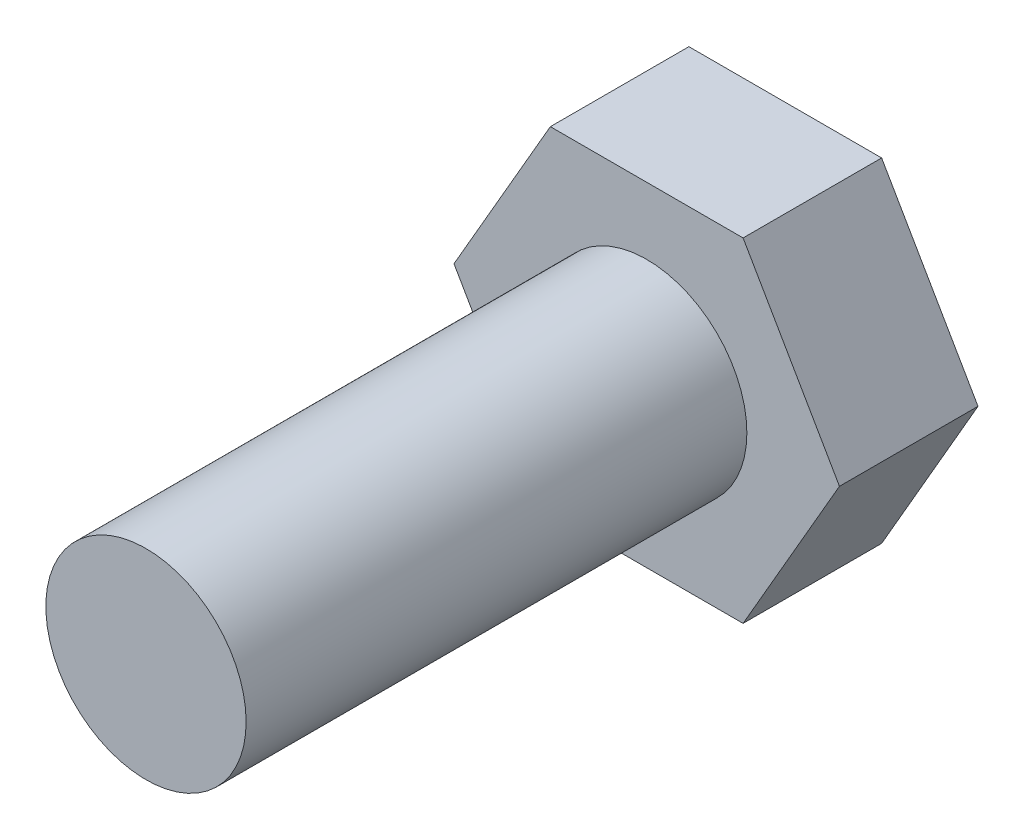
ISO-10303-21;
HEADER;
FILE_DESCRIPTION(('STEP AP214'),'2;1');
FILE_NAME('part.step','',(''),(''),'','','');
FILE_SCHEMA(('AUTOMOTIVE_DESIGN { 1 0 10303 214 1 1 1 1 }'));
ENDSEC;
DATA;
#1=APPLICATION_CONTEXT('core data for automotive mechanical design processes');
#2=APPLICATION_PROTOCOL_DEFINITION('international standard','automotive_design',2000,#1);
#3=PRODUCT_CONTEXT('',#1,'mechanical');
#4=PRODUCT('Part','Part','',(#3));
#5=PRODUCT_RELATED_PRODUCT_CATEGORY('part','',(#4));
#6=PRODUCT_DEFINITION_FORMATION('','',#4);
#7=PRODUCT_DEFINITION_CONTEXT('part definition',#1,'design');
#8=PRODUCT_DEFINITION('design','',#6,#7);
#9=PRODUCT_DEFINITION_SHAPE('','',#8);
#10=(LENGTH_UNIT() NAMED_UNIT(*) SI_UNIT(.MILLI.,.METRE.));
#11=(NAMED_UNIT(*) PLANE_ANGLE_UNIT() SI_UNIT($,.RADIAN.));
#12=(NAMED_UNIT(*) SI_UNIT($,.STERADIAN.) SOLID_ANGLE_UNIT());
#13=UNCERTAINTY_MEASURE_WITH_UNIT(LENGTH_MEASURE(1.E-05),#10,'distance_accuracy_value','');
#14=(GEOMETRIC_REPRESENTATION_CONTEXT(3) GLOBAL_UNCERTAINTY_ASSIGNED_CONTEXT((#13)) GLOBAL_UNIT_ASSIGNED_CONTEXT((#10,
#11,#12)) REPRESENTATION_CONTEXT('',''));
#15=CARTESIAN_POINT('',(0.,0.,0.));
#16=DIRECTION('',(0.,0.,1.));
#17=DIRECTION('',(1.,0.,0.));
#18=AXIS2_PLACEMENT_3D('',#15,#16,#17);
#19=CARTESIAN_POINT('',(2.88675134594813,5.,4.15));
#20=DIRECTION('',(0.,-1.,0.));
#21=DIRECTION('',(1.,0.,0.));
#22=AXIS2_PLACEMENT_3D('',#19,#20,#21);
#23=PLANE('',#22);
#24=DIRECTION('',(-1.,0.,0.));
#25=VECTOR('',#24,1.);
#26=CARTESIAN_POINT('',(2.88675134594813,5.,0.));
#27=LINE('',#26,#25);
#28=CARTESIAN_POINT('',(2.88675134594813,5.,0.));
#29=VERTEX_POINT('',#28);
#30=CARTESIAN_POINT('',(-2.88675134594813,5.,0.));
#31=VERTEX_POINT('',#30);
#32=EDGE_CURVE('E125',#29,#31,#27,.T.);
#33=ORIENTED_EDGE('',*,*,#32,.T.);
#34=DIRECTION('',(0.,0.,-1.));
#35=VECTOR('',#34,1.);
#36=CARTESIAN_POINT('',(-2.88675134594813,5.,4.15));
#37=LINE('',#36,#35);
#38=CARTESIAN_POINT('',(-2.88675134594813,5.,4.15));
#39=VERTEX_POINT('',#38);
#40=EDGE_CURVE('E42',#39,#31,#37,.T.);
#41=ORIENTED_EDGE('',*,*,#40,.F.);
#42=DIRECTION('',(-1.,0.,0.));
#43=VECTOR('',#42,1.);
#44=CARTESIAN_POINT('',(2.88675134594813,5.,4.15));
#45=LINE('',#44,#43);
#46=CARTESIAN_POINT('',(2.88675134594813,5.,4.15));
#47=VERTEX_POINT('',#46);
#48=EDGE_CURVE('E136',#47,#39,#45,.T.);
#49=ORIENTED_EDGE('',*,*,#48,.F.);
#50=DIRECTION('',(0.,0.,-1.));
#51=VECTOR('',#50,1.);
#52=CARTESIAN_POINT('',(2.88675134594813,5.,4.15));
#53=LINE('',#52,#51);
#54=EDGE_CURVE('E121',#47,#29,#53,.T.);
#55=ORIENTED_EDGE('',*,*,#54,.T.);
#56=EDGE_LOOP('',(#33,#41,#49,#55));
#57=FACE_BOUND('',#56,.T.);
#58=ADVANCED_FACE('F39',(#57),#23,.F.);
#59=CARTESIAN_POINT('',(-2.88675134594813,5.,4.15));
#60=DIRECTION('',(0.866025403784439,-0.499999999999999,0.));
#61=DIRECTION('',(0.5,0.866025403784439,0.));
#62=AXIS2_PLACEMENT_3D('',#59,#60,#61);
#63=PLANE('',#62);
#64=DIRECTION('',(-0.5,-0.866025403784439,0.));
#65=VECTOR('',#64,1.);
#66=CARTESIAN_POINT('',(-2.88675134594813,5.,0.));
#67=LINE('',#66,#65);
#68=CARTESIAN_POINT('',(-5.77350269189626,0.,0.));
#69=VERTEX_POINT('',#68);
#70=EDGE_CURVE('E128',#31,#69,#67,.T.);
#71=ORIENTED_EDGE('',*,*,#70,.T.);
#72=DIRECTION('',(0.,0.,-1.));
#73=VECTOR('',#72,1.);
#74=CARTESIAN_POINT('',(-5.77350269189626,0.,4.15));
#75=LINE('',#74,#73);
#76=CARTESIAN_POINT('',(-5.77350269189626,0.,4.15));
#77=VERTEX_POINT('',#76);
#78=EDGE_CURVE('E139',#77,#69,#75,.T.);
#79=ORIENTED_EDGE('',*,*,#78,.F.);
#80=DIRECTION('',(-0.5,-0.866025403784439,0.));
#81=VECTOR('',#80,1.);
#82=CARTESIAN_POINT('',(-2.88675134594813,5.,4.15));
#83=LINE('',#82,#81);
#84=EDGE_CURVE('E94',#39,#77,#83,.T.);
#85=ORIENTED_EDGE('',*,*,#84,.F.);
#86=ORIENTED_EDGE('',*,*,#40,.T.);
#87=EDGE_LOOP('',(#71,#79,#85,#86));
#88=FACE_BOUND('',#87,.T.);
#89=ADVANCED_FACE('F144',(#88),#63,.F.);
#90=CARTESIAN_POINT('',(-5.77350269189626,0.,4.15));
#91=DIRECTION('',(0.866025403784438,0.5,0.));
#92=DIRECTION('',(-0.5,0.866025403784439,0.));
#93=AXIS2_PLACEMENT_3D('',#90,#91,#92);
#94=PLANE('',#93);
#95=DIRECTION('',(0.5,-0.866025403784438,0.));
#96=VECTOR('',#95,1.);
#97=CARTESIAN_POINT('',(-5.77350269189626,0.,0.));
#98=LINE('',#97,#96);
#99=CARTESIAN_POINT('',(-2.88675134594812,-5.,0.));
#100=VERTEX_POINT('',#99);
#101=EDGE_CURVE('E131',#69,#100,#98,.T.);
#102=ORIENTED_EDGE('',*,*,#101,.T.);
#103=DIRECTION('',(0.,0.,-1.));
#104=VECTOR('',#103,1.);
#105=CARTESIAN_POINT('',(-2.88675134594812,-5.,4.15));
#106=LINE('',#105,#104);
#107=CARTESIAN_POINT('',(-2.88675134594812,-5.,4.15));
#108=VERTEX_POINT('',#107);
#109=EDGE_CURVE('E116',#108,#100,#106,.T.);
#110=ORIENTED_EDGE('',*,*,#109,.F.);
#111=DIRECTION('',(0.5,-0.866025403784438,0.));
#112=VECTOR('',#111,1.);
#113=CARTESIAN_POINT('',(-5.77350269189626,0.,4.15));
#114=LINE('',#113,#112);
#115=EDGE_CURVE('E107',#77,#108,#114,.T.);
#116=ORIENTED_EDGE('',*,*,#115,.F.);
#117=ORIENTED_EDGE('',*,*,#78,.T.);
#118=EDGE_LOOP('',(#102,#110,#116,#117));
#119=FACE_BOUND('',#118,.T.);
#120=ADVANCED_FACE('F150',(#119),#94,.F.);
#121=CARTESIAN_POINT('',(-2.88675134594812,-5.,4.15));
#122=DIRECTION('',(0.,1.,0.));
#123=DIRECTION('',(-1.,0.,0.));
#124=AXIS2_PLACEMENT_3D('',#121,#122,#123);
#125=PLANE('',#124);
#126=DIRECTION('',(1.,0.,0.));
#127=VECTOR('',#126,1.);
#128=CARTESIAN_POINT('',(-2.88675134594812,-5.,0.));
#129=LINE('',#128,#127);
#130=CARTESIAN_POINT('',(2.88675134594813,-5.,0.));
#131=VERTEX_POINT('',#130);
#132=EDGE_CURVE('E115',#100,#131,#129,.T.);
#133=ORIENTED_EDGE('',*,*,#132,.T.);
#134=DIRECTION('',(0.,0.,-1.));
#135=VECTOR('',#134,1.);
#136=CARTESIAN_POINT('',(2.88675134594813,-5.,4.15));
#137=LINE('',#136,#135);
#138=CARTESIAN_POINT('',(2.88675134594813,-5.,4.15));
#139=VERTEX_POINT('',#138);
#140=EDGE_CURVE('E112',#139,#131,#137,.T.);
#141=ORIENTED_EDGE('',*,*,#140,.F.);
#142=DIRECTION('',(1.,0.,0.));
#143=VECTOR('',#142,1.);
#144=CARTESIAN_POINT('',(-2.88675134594812,-5.,4.15));
#145=LINE('',#144,#143);
#146=EDGE_CURVE('E101',#108,#139,#145,.T.);
#147=ORIENTED_EDGE('',*,*,#146,.F.);
#148=ORIENTED_EDGE('',*,*,#109,.T.);
#149=EDGE_LOOP('',(#133,#141,#147,#148));
#150=FACE_BOUND('',#149,.T.);
#151=ADVANCED_FACE('F113',(#150),#125,.F.);
#152=CARTESIAN_POINT('',(2.88675134594813,-5.,4.15));
#153=DIRECTION('',(-0.866025403784439,0.5,0.));
#154=DIRECTION('',(-0.5,-0.866025403784439,0.));
#155=AXIS2_PLACEMENT_3D('',#152,#153,#154);
#156=PLANE('',#155);
#157=DIRECTION('',(0.5,0.866025403784439,0.));
#158=VECTOR('',#157,1.);
#159=CARTESIAN_POINT('',(2.88675134594813,-5.,0.));
#160=LINE('',#159,#158);
#161=CARTESIAN_POINT('',(5.77350269189626,0.,0.));
#162=VERTEX_POINT('',#161);
#163=EDGE_CURVE('E79',#131,#162,#160,.T.);
#164=ORIENTED_EDGE('',*,*,#163,.T.);
#165=DIRECTION('',(0.,0.,-1.));
#166=VECTOR('',#165,1.);
#167=CARTESIAN_POINT('',(5.77350269189626,0.,4.15));
#168=LINE('',#167,#166);
#169=CARTESIAN_POINT('',(5.77350269189626,0.,4.15));
#170=VERTEX_POINT('',#169);
#171=EDGE_CURVE('E117',#170,#162,#168,.T.);
#172=ORIENTED_EDGE('',*,*,#171,.F.);
#173=DIRECTION('',(0.5,0.866025403784439,0.));
#174=VECTOR('',#173,1.);
#175=CARTESIAN_POINT('',(2.88675134594813,-5.,4.15));
#176=LINE('',#175,#174);
#177=EDGE_CURVE('E105',#139,#170,#176,.T.);
#178=ORIENTED_EDGE('',*,*,#177,.F.);
#179=ORIENTED_EDGE('',*,*,#140,.T.);
#180=EDGE_LOOP('',(#164,#172,#178,#179));
#181=FACE_BOUND('',#180,.T.);
#182=ADVANCED_FACE('F119',(#181),#156,.F.);
#183=CARTESIAN_POINT('',(5.77350269189626,0.,4.15));
#184=DIRECTION('',(-0.866025403784438,-0.5,0.));
#185=DIRECTION('',(0.5,-0.866025403784439,0.));
#186=AXIS2_PLACEMENT_3D('',#183,#184,#185);
#187=PLANE('',#186);
#188=DIRECTION('',(-0.5,0.866025403784439,0.));
#189=VECTOR('',#188,1.);
#190=CARTESIAN_POINT('',(5.77350269189626,0.,0.));
#191=LINE('',#190,#189);
#192=EDGE_CURVE('E85',#162,#29,#191,.T.);
#193=ORIENTED_EDGE('',*,*,#192,.T.);
#194=ORIENTED_EDGE('',*,*,#54,.F.);
#195=DIRECTION('',(-0.5,0.866025403784439,0.));
#196=VECTOR('',#195,1.);
#197=CARTESIAN_POINT('',(5.77350269189626,0.,4.15));
#198=LINE('',#197,#196);
#199=EDGE_CURVE('E56',#170,#47,#198,.T.);
#200=ORIENTED_EDGE('',*,*,#199,.F.);
#201=ORIENTED_EDGE('',*,*,#171,.T.);
#202=EDGE_LOOP('',(#193,#194,#200,#201));
#203=FACE_BOUND('',#202,.T.);
#204=ADVANCED_FACE('F166',(#203),#187,.F.);
#205=CARTESIAN_POINT('',(0.,0.,4.15));
#206=DIRECTION('',(0.,0.,1.));
#207=DIRECTION('',(1.,0.,0.));
#208=AXIS2_PLACEMENT_3D('',#205,#206,#207);
#209=PLANE('',#208);
#210=CARTESIAN_POINT('',(0.,0.,4.15));
#211=DIRECTION('',(0.,0.,1.));
#212=DIRECTION('',(1.,0.,0.));
#213=AXIS2_PLACEMENT_3D('',#210,#211,#212);
#214=CIRCLE('',#213,3.);
#215=CARTESIAN_POINT('',(3.,0.,4.15));
#216=VERTEX_POINT('',#215);
#217=EDGE_CURVE('E11',#216,#216,#214,.T.);
#218=ORIENTED_EDGE('',*,*,#217,.F.);
#219=EDGE_LOOP('',(#218));
#220=FACE_BOUND('',#219,.T.);
#221=ORIENTED_EDGE('',*,*,#48,.T.);
#222=ORIENTED_EDGE('',*,*,#84,.T.);
#223=ORIENTED_EDGE('',*,*,#115,.T.);
#224=ORIENTED_EDGE('',*,*,#146,.T.);
#225=ORIENTED_EDGE('',*,*,#177,.T.);
#226=ORIENTED_EDGE('',*,*,#199,.T.);
#227=EDGE_LOOP('',(#221,#222,#223,#224,#225,#226));
#228=FACE_BOUND('',#227,.T.);
#229=ADVANCED_FACE('F103',(#220,#228),#209,.T.);
#230=CARTESIAN_POINT('',(0.,0.,0.));
#231=DIRECTION('',(0.,0.,1.));
#232=DIRECTION('',(1.,0.,0.));
#233=AXIS2_PLACEMENT_3D('',#230,#231,#232);
#234=PLANE('',#233);
#235=ORIENTED_EDGE('',*,*,#32,.F.);
#236=ORIENTED_EDGE('',*,*,#192,.F.);
#237=ORIENTED_EDGE('',*,*,#163,.F.);
#238=ORIENTED_EDGE('',*,*,#132,.F.);
#239=ORIENTED_EDGE('',*,*,#101,.F.);
#240=ORIENTED_EDGE('',*,*,#70,.F.);
#241=EDGE_LOOP('',(#235,#236,#237,#238,#239,#240));
#242=FACE_BOUND('',#241,.T.);
#243=ADVANCED_FACE('F149',(#242),#234,.F.);
#244=CARTESIAN_POINT('',(0.,0.,19.15));
#245=DIRECTION('',(0.,0.,-1.));
#246=DIRECTION('',(-1.,0.,0.));
#247=AXIS2_PLACEMENT_3D('',#244,#245,#246);
#248=CYLINDRICAL_SURFACE('',#247,3.);
#249=CARTESIAN_POINT('',(0.,0.,19.15));
#250=DIRECTION('',(0.,0.,1.));
#251=DIRECTION('',(1.,0.,0.));
#252=AXIS2_PLACEMENT_3D('',#249,#250,#251);
#253=CIRCLE('',#252,3.);
#254=CARTESIAN_POINT('',(3.,0.,19.15));
#255=VERTEX_POINT('',#254);
#256=EDGE_CURVE('E129',#255,#255,#253,.T.);
#257=ORIENTED_EDGE('',*,*,#256,.F.);
#258=EDGE_LOOP('',(#257));
#259=FACE_BOUND('',#258,.T.);
#260=ORIENTED_EDGE('',*,*,#217,.T.);
#261=EDGE_LOOP('',(#260));
#262=FACE_BOUND('',#261,.T.);
#263=ADVANCED_FACE('F159',(#259,#262),#248,.T.);
#264=CARTESIAN_POINT('',(0.,0.,19.15));
#265=DIRECTION('',(0.,0.,1.));
#266=DIRECTION('',(1.,0.,0.));
#267=AXIS2_PLACEMENT_3D('',#264,#265,#266);
#268=PLANE('',#267);
#269=ORIENTED_EDGE('',*,*,#256,.T.);
#270=EDGE_LOOP('',(#269));
#271=FACE_BOUND('',#270,.T.);
#272=ADVANCED_FACE('F157',(#271),#268,.T.);
#273=CLOSED_SHELL('',(#58,#89,#120,#151,#182,#204,#229,#243,#263,#272));
#274=MANIFOLD_SOLID_BREP('B2',#273);
#275=ADVANCED_BREP_SHAPE_REPRESENTATION('',(#18,#274),#14);
#276=SHAPE_DEFINITION_REPRESENTATION(#9,#275);
ENDSEC;
END-ISO-10303-21;
